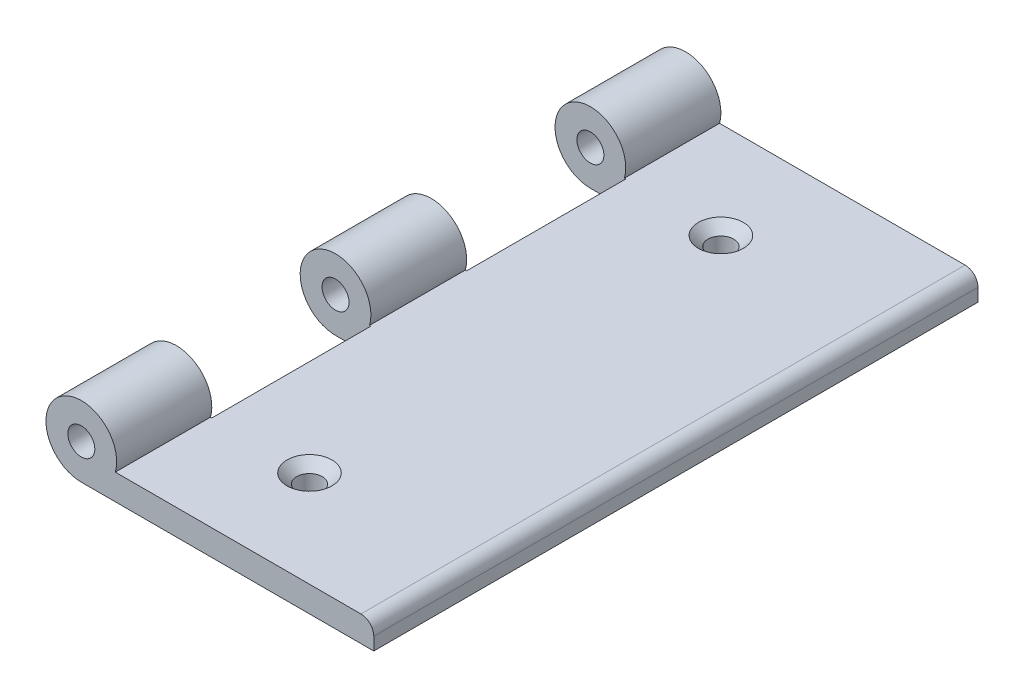
ISO-10303-21;
HEADER;
FILE_DESCRIPTION(('STEP AP214'),'2;1');
FILE_NAME('part.step','',(''),(''),'','','');
FILE_SCHEMA(('AUTOMOTIVE_DESIGN { 1 0 10303 214 1 1 1 1 }'));
ENDSEC;
DATA;
#1=APPLICATION_CONTEXT('core data for automotive mechanical design processes');
#2=APPLICATION_PROTOCOL_DEFINITION('international standard','automotive_design',2000,#1);
#3=PRODUCT_CONTEXT('',#1,'mechanical');
#4=PRODUCT('Part','Part','',(#3));
#5=PRODUCT_RELATED_PRODUCT_CATEGORY('part','',(#4));
#6=PRODUCT_DEFINITION_FORMATION('','',#4);
#7=PRODUCT_DEFINITION_CONTEXT('part definition',#1,'design');
#8=PRODUCT_DEFINITION('design','',#6,#7);
#9=PRODUCT_DEFINITION_SHAPE('','',#8);
#10=(LENGTH_UNIT() NAMED_UNIT(*) SI_UNIT(.MILLI.,.METRE.));
#11=(NAMED_UNIT(*) PLANE_ANGLE_UNIT() SI_UNIT($,.RADIAN.));
#12=(NAMED_UNIT(*) SI_UNIT($,.STERADIAN.) SOLID_ANGLE_UNIT());
#13=UNCERTAINTY_MEASURE_WITH_UNIT(LENGTH_MEASURE(1.E-05),#10,'distance_accuracy_value','');
#14=(GEOMETRIC_REPRESENTATION_CONTEXT(3) GLOBAL_UNCERTAINTY_ASSIGNED_CONTEXT((#13)) GLOBAL_UNIT_ASSIGNED_CONTEXT((#10,
#11,#12)) REPRESENTATION_CONTEXT('',''));
#15=CARTESIAN_POINT('',(0.,0.,0.));
#16=DIRECTION('',(0.,0.,1.));
#17=DIRECTION('',(1.,0.,0.));
#18=AXIS2_PLACEMENT_3D('',#15,#16,#17);
#19=CARTESIAN_POINT('',(0.,4.,0.));
#20=DIRECTION('',(0.,1.,0.));
#21=DIRECTION('',(0.,0.,1.));
#22=AXIS2_PLACEMENT_3D('',#19,#20,#21);
#23=PLANE('',#22);
#24=CARTESIAN_POINT('',(-4.99999999999999,4.,32.));
#25=DIRECTION('',(0.,1.,0.));
#26=DIRECTION('',(0.,0.,1.));
#27=AXIS2_PLACEMENT_3D('',#24,#25,#26);
#28=CIRCLE('',#27,3.50000000000002);
#29=CARTESIAN_POINT('',(-4.99999999999999,4.,35.5));
#30=VERTEX_POINT('',#29);
#31=EDGE_CURVE('E255',#30,#30,#28,.F.);
#32=ORIENTED_EDGE('',*,*,#31,.T.);
#33=EDGE_LOOP('',(#32));
#34=FACE_BOUND('',#33,.T.);
#35=CARTESIAN_POINT('',(-4.99999999999999,4.,-32.));
#36=DIRECTION('',(0.,1.,0.));
#37=DIRECTION('',(0.,0.,1.));
#38=AXIS2_PLACEMENT_3D('',#35,#36,#37);
#39=CIRCLE('',#38,3.50000000000002);
#40=CARTESIAN_POINT('',(-4.99999999999999,4.,-28.5));
#41=VERTEX_POINT('',#40);
#42=EDGE_CURVE('E252',#41,#41,#39,.F.);
#43=ORIENTED_EDGE('',*,*,#42,.T.);
#44=EDGE_LOOP('',(#43));
#45=FACE_BOUND('',#44,.T.);
#46=DIRECTION('',(1.,0.,0.));
#47=VECTOR('',#46,1.);
#48=CARTESIAN_POINT('',(-20.,4.,47.));
#49=LINE('',#48,#47);
#50=CARTESIAN_POINT('',(-20.2084973778708,4.,47.));
#51=VERTEX_POINT('',#50);
#52=CARTESIAN_POINT('',(18.,4.,47.));
#53=VERTEX_POINT('',#52);
#54=EDGE_CURVE('E221',#51,#53,#49,.T.);
#55=ORIENTED_EDGE('',*,*,#54,.T.);
#56=DIRECTION('',(0.,0.,-1.));
#57=VECTOR('',#56,1.);
#58=CARTESIAN_POINT('',(18.,4.,-47.));
#59=LINE('',#58,#57);
#60=CARTESIAN_POINT('',(18.,4.,-47.));
#61=VERTEX_POINT('',#60);
#62=EDGE_CURVE('E261',#53,#61,#59,.T.);
#63=ORIENTED_EDGE('',*,*,#62,.T.);
#64=DIRECTION('',(-1.,0.,0.));
#65=VECTOR('',#64,1.);
#66=CARTESIAN_POINT('',(-20.,4.,-47.));
#67=LINE('',#66,#65);
#68=CARTESIAN_POINT('',(-20.2084973778708,4.,-47.));
#69=VERTEX_POINT('',#68);
#70=EDGE_CURVE('E219',#61,#69,#67,.T.);
#71=ORIENTED_EDGE('',*,*,#70,.T.);
#72=DIRECTION('',(0.,0.,-1.));
#73=VECTOR('',#72,1.);
#74=CARTESIAN_POINT('',(-20.2084973778708,4.,47.));
#75=LINE('',#74,#73);
#76=CARTESIAN_POINT('',(-20.2084973778708,4.,-32.1999999999999));
#77=VERTEX_POINT('',#76);
#78=EDGE_CURVE('E213',#77,#69,#75,.T.);
#79=ORIENTED_EDGE('',*,*,#78,.F.);
#80=DIRECTION('',(1.,0.,0.));
#81=VECTOR('',#80,1.);
#82=CARTESIAN_POINT('',(0.,4.,-32.2));
#83=LINE('',#82,#81);
#84=CARTESIAN_POINT('',(-20.,4.,-32.2));
#85=VERTEX_POINT('',#84);
#86=EDGE_CURVE('E185',#77,#85,#83,.T.);
#87=ORIENTED_EDGE('',*,*,#86,.T.);
#88=DIRECTION('',(0.,0.,1.));
#89=VECTOR('',#88,1.);
#90=CARTESIAN_POINT('',(-20.,4.,0.));
#91=LINE('',#90,#89);
#92=CARTESIAN_POINT('',(-20.,4.,-7.45));
#93=VERTEX_POINT('',#92);
#94=EDGE_CURVE('E195',#85,#93,#91,.T.);
#95=ORIENTED_EDGE('',*,*,#94,.T.);
#96=DIRECTION('',(-1.,0.,0.));
#97=VECTOR('',#96,1.);
#98=CARTESIAN_POINT('',(0.,4.,-7.45));
#99=LINE('',#98,#97);
#100=CARTESIAN_POINT('',(-20.2084973778708,4.,-7.45));
#101=VERTEX_POINT('',#100);
#102=EDGE_CURVE('E135',#93,#101,#99,.T.);
#103=ORIENTED_EDGE('',*,*,#102,.T.);
#104=CARTESIAN_POINT('',(-20.2084973778708,4.,7.45000000000001));
#105=VERTEX_POINT('',#104);
#106=EDGE_CURVE('E218',#105,#101,#75,.T.);
#107=ORIENTED_EDGE('',*,*,#106,.F.);
#108=DIRECTION('',(1.,0.,0.));
#109=VECTOR('',#108,1.);
#110=CARTESIAN_POINT('',(0.,4.,7.45));
#111=LINE('',#110,#109);
#112=CARTESIAN_POINT('',(-20.,4.,7.45));
#113=VERTEX_POINT('',#112);
#114=EDGE_CURVE('E173',#105,#113,#111,.T.);
#115=ORIENTED_EDGE('',*,*,#114,.T.);
#116=DIRECTION('',(0.,0.,1.));
#117=VECTOR('',#116,1.);
#118=CARTESIAN_POINT('',(-20.,4.,0.));
#119=LINE('',#118,#117);
#120=CARTESIAN_POINT('',(-20.,4.,32.2));
#121=VERTEX_POINT('',#120);
#122=EDGE_CURVE('E192',#113,#121,#119,.T.);
#123=ORIENTED_EDGE('',*,*,#122,.T.);
#124=DIRECTION('',(-1.,0.,0.));
#125=VECTOR('',#124,1.);
#126=CARTESIAN_POINT('',(0.,4.,32.2));
#127=LINE('',#126,#125);
#128=CARTESIAN_POINT('',(-20.2084973778708,4.,32.2));
#129=VERTEX_POINT('',#128);
#130=EDGE_CURVE('E179',#121,#129,#127,.T.);
#131=ORIENTED_EDGE('',*,*,#130,.T.);
#132=EDGE_CURVE('E214',#51,#129,#75,.T.);
#133=ORIENTED_EDGE('',*,*,#132,.F.);
#134=EDGE_LOOP('',(#55,#63,#71,#79,#87,#95,#103,#107,#115,#123,#131,#133));
#135=FACE_BOUND('',#134,.T.);
#136=ADVANCED_FACE('F35',(#34,#45,#135),#23,.T.);
#137=CARTESIAN_POINT('',(0.,0.,0.));
#138=DIRECTION('',(0.,1.,0.));
#139=DIRECTION('',(0.,0.,1.));
#140=AXIS2_PLACEMENT_3D('',#137,#138,#139);
#141=PLANE('',#140);
#142=CARTESIAN_POINT('',(-4.99999999999999,0.,-32.));
#143=DIRECTION('',(0.,1.,0.));
#144=DIRECTION('',(0.,0.,1.));
#145=AXIS2_PLACEMENT_3D('',#142,#143,#144);
#146=CIRCLE('',#145,2.);
#147=CARTESIAN_POINT('',(-4.99999999999999,0.,-30.));
#148=VERTEX_POINT('',#147);
#149=EDGE_CURVE('E165',#148,#148,#146,.T.);
#150=ORIENTED_EDGE('',*,*,#149,.T.);
#151=EDGE_LOOP('',(#150));
#152=FACE_BOUND('',#151,.T.);
#153=CARTESIAN_POINT('',(-4.99999999999999,0.,32.));
#154=DIRECTION('',(0.,1.,0.));
#155=DIRECTION('',(0.,0.,1.));
#156=AXIS2_PLACEMENT_3D('',#153,#154,#155);
#157=CIRCLE('',#156,2.);
#158=CARTESIAN_POINT('',(-4.99999999999999,0.,34.));
#159=VERTEX_POINT('',#158);
#160=EDGE_CURVE('E245',#159,#159,#157,.T.);
#161=ORIENTED_EDGE('',*,*,#160,.T.);
#162=EDGE_LOOP('',(#161));
#163=FACE_BOUND('',#162,.T.);
#164=DIRECTION('',(1.,0.,0.));
#165=VECTOR('',#164,1.);
#166=CARTESIAN_POINT('',(-31.,0.,-7.45));
#167=LINE('',#166,#165);
#168=CARTESIAN_POINT('',(-25.5,0.,-7.45));
#169=VERTEX_POINT('',#168);
#170=CARTESIAN_POINT('',(-20.,0.,-7.45));
#171=VERTEX_POINT('',#170);
#172=EDGE_CURVE('E132',#169,#171,#167,.T.);
#173=ORIENTED_EDGE('',*,*,#172,.T.);
#174=DIRECTION('',(0.,0.,-1.));
#175=VECTOR('',#174,1.);
#176=CARTESIAN_POINT('',(-20.,0.,-32.2));
#177=LINE('',#176,#175);
#178=CARTESIAN_POINT('',(-20.,0.,-32.2));
#179=VERTEX_POINT('',#178);
#180=EDGE_CURVE('E142',#171,#179,#177,.T.);
#181=ORIENTED_EDGE('',*,*,#180,.T.);
#182=DIRECTION('',(-1.,0.,0.));
#183=VECTOR('',#182,1.);
#184=CARTESIAN_POINT('',(-31.,0.,-32.2));
#185=LINE('',#184,#183);
#186=CARTESIAN_POINT('',(-25.5,0.,-32.2));
#187=VERTEX_POINT('',#186);
#188=EDGE_CURVE('E148',#179,#187,#185,.T.);
#189=ORIENTED_EDGE('',*,*,#188,.T.);
#190=DIRECTION('',(0.,0.,-1.));
#191=VECTOR('',#190,1.);
#192=CARTESIAN_POINT('',(-25.5,0.,47.));
#193=LINE('',#192,#191);
#194=CARTESIAN_POINT('',(-25.5,0.,-47.));
#195=VERTEX_POINT('',#194);
#196=EDGE_CURVE('E209',#187,#195,#193,.T.);
#197=ORIENTED_EDGE('',*,*,#196,.T.);
#198=DIRECTION('',(-1.,0.,0.));
#199=VECTOR('',#198,1.);
#200=CARTESIAN_POINT('',(-20.,0.,-47.));
#201=LINE('',#200,#199);
#202=CARTESIAN_POINT('',(20.,0.,-47.));
#203=VERTEX_POINT('',#202);
#204=EDGE_CURVE('E228',#203,#195,#201,.T.);
#205=ORIENTED_EDGE('',*,*,#204,.F.);
#206=DIRECTION('',(0.,0.,-1.));
#207=VECTOR('',#206,1.);
#208=CARTESIAN_POINT('',(20.,0.,-47.));
#209=LINE('',#208,#207);
#210=CARTESIAN_POINT('',(20.,0.,47.));
#211=VERTEX_POINT('',#210);
#212=EDGE_CURVE('E217',#211,#203,#209,.T.);
#213=ORIENTED_EDGE('',*,*,#212,.F.);
#214=DIRECTION('',(1.,0.,0.));
#215=VECTOR('',#214,1.);
#216=CARTESIAN_POINT('',(-20.,0.,47.));
#217=LINE('',#216,#215);
#218=CARTESIAN_POINT('',(-25.5,0.,47.));
#219=VERTEX_POINT('',#218);
#220=EDGE_CURVE('E222',#219,#211,#217,.T.);
#221=ORIENTED_EDGE('',*,*,#220,.F.);
#222=CARTESIAN_POINT('',(-25.5,0.,32.2));
#223=VERTEX_POINT('',#222);
#224=EDGE_CURVE('E210',#219,#223,#193,.T.);
#225=ORIENTED_EDGE('',*,*,#224,.T.);
#226=DIRECTION('',(1.,0.,0.));
#227=VECTOR('',#226,1.);
#228=CARTESIAN_POINT('',(-31.,0.,32.2));
#229=LINE('',#228,#227);
#230=CARTESIAN_POINT('',(-20.,0.,32.2));
#231=VERTEX_POINT('',#230);
#232=EDGE_CURVE('E161',#223,#231,#229,.T.);
#233=ORIENTED_EDGE('',*,*,#232,.T.);
#234=DIRECTION('',(0.,0.,-1.));
#235=VECTOR('',#234,1.);
#236=CARTESIAN_POINT('',(-20.,0.,7.45));
#237=LINE('',#236,#235);
#238=CARTESIAN_POINT('',(-20.,0.,7.45));
#239=VERTEX_POINT('',#238);
#240=EDGE_CURVE('E164',#231,#239,#237,.T.);
#241=ORIENTED_EDGE('',*,*,#240,.T.);
#242=DIRECTION('',(-1.,0.,0.));
#243=VECTOR('',#242,1.);
#244=CARTESIAN_POINT('',(-31.,0.,7.45));
#245=LINE('',#244,#243);
#246=CARTESIAN_POINT('',(-25.5,0.,7.45));
#247=VERTEX_POINT('',#246);
#248=EDGE_CURVE('E168',#239,#247,#245,.T.);
#249=ORIENTED_EDGE('',*,*,#248,.T.);
#250=EDGE_CURVE('E153',#247,#169,#193,.T.);
#251=ORIENTED_EDGE('',*,*,#250,.T.);
#252=EDGE_LOOP('',(#173,#181,#189,#197,#205,#213,#221,#225,#233,#241,#249,#251));
#253=FACE_BOUND('',#252,.T.);
#254=ADVANCED_FACE('F150',(#152,#163,#253),#141,.F.);
#255=CARTESIAN_POINT('',(-25.5,5.5,47.));
#256=DIRECTION('',(0.,0.,-1.));
#257=DIRECTION('',(-1.,0.,0.));
#258=AXIS2_PLACEMENT_3D('',#255,#256,#257);
#259=CYLINDRICAL_SURFACE('',#258,5.5);
#260=CARTESIAN_POINT('',(-25.5,5.5,-7.45));
#261=DIRECTION('',(0.,0.,-1.));
#262=DIRECTION('',(-1.,0.,0.));
#263=AXIS2_PLACEMENT_3D('',#260,#261,#262);
#264=CIRCLE('',#263,5.5);
#265=EDGE_CURVE('E189',#169,#101,#264,.T.);
#266=ORIENTED_EDGE('',*,*,#265,.F.);
#267=ORIENTED_EDGE('',*,*,#250,.F.);
#268=CARTESIAN_POINT('',(-25.5,5.5,7.45));
#269=DIRECTION('',(0.,0.,1.));
#270=DIRECTION('',(1.,0.,0.));
#271=AXIS2_PLACEMENT_3D('',#268,#269,#270);
#272=CIRCLE('',#271,5.5);
#273=EDGE_CURVE('E171',#105,#247,#272,.T.);
#274=ORIENTED_EDGE('',*,*,#273,.F.);
#275=ORIENTED_EDGE('',*,*,#106,.T.);
#276=EDGE_LOOP('',(#266,#267,#274,#275));
#277=FACE_BOUND('',#276,.T.);
#278=ADVANCED_FACE('F283',(#277),#259,.T.);
#279=ORIENTED_EDGE('',*,*,#196,.F.);
#280=CARTESIAN_POINT('',(-25.5,5.5,-32.2));
#281=DIRECTION('',(0.,0.,1.));
#282=DIRECTION('',(1.,0.,0.));
#283=AXIS2_PLACEMENT_3D('',#280,#281,#282);
#284=CIRCLE('',#283,5.5);
#285=EDGE_CURVE('E183',#77,#187,#284,.T.);
#286=ORIENTED_EDGE('',*,*,#285,.F.);
#287=ORIENTED_EDGE('',*,*,#78,.T.);
#288=CARTESIAN_POINT('',(-25.5,5.5,-47.));
#289=DIRECTION('',(0.,0.,1.));
#290=DIRECTION('',(1.,0.,0.));
#291=AXIS2_PLACEMENT_3D('',#288,#289,#290);
#292=CIRCLE('',#291,5.5);
#293=EDGE_CURVE('E200',#69,#195,#292,.T.);
#294=ORIENTED_EDGE('',*,*,#293,.T.);
#295=EDGE_LOOP('',(#279,#286,#287,#294));
#296=FACE_BOUND('',#295,.T.);
#297=ADVANCED_FACE('F277',(#296),#259,.T.);
#298=CARTESIAN_POINT('',(-25.5,5.5,32.2));
#299=DIRECTION('',(0.,0.,-1.));
#300=DIRECTION('',(-1.,0.,0.));
#301=AXIS2_PLACEMENT_3D('',#298,#299,#300);
#302=CIRCLE('',#301,5.5);
#303=EDGE_CURVE('E177',#223,#129,#302,.T.);
#304=ORIENTED_EDGE('',*,*,#303,.F.);
#305=ORIENTED_EDGE('',*,*,#224,.F.);
#306=CARTESIAN_POINT('',(-25.5,5.5,47.));
#307=DIRECTION('',(0.,0.,1.));
#308=DIRECTION('',(1.,0.,0.));
#309=AXIS2_PLACEMENT_3D('',#306,#307,#308);
#310=CIRCLE('',#309,5.5);
#311=EDGE_CURVE('E206',#51,#219,#310,.T.);
#312=ORIENTED_EDGE('',*,*,#311,.F.);
#313=ORIENTED_EDGE('',*,*,#132,.T.);
#314=EDGE_LOOP('',(#304,#305,#312,#313));
#315=FACE_BOUND('',#314,.T.);
#316=ADVANCED_FACE('F295',(#315),#259,.T.);
#317=CARTESIAN_POINT('',(-25.5,5.5,47.));
#318=DIRECTION('',(0.,0.,-1.));
#319=DIRECTION('',(-1.,0.,0.));
#320=AXIS2_PLACEMENT_3D('',#317,#318,#319);
#321=CYLINDRICAL_SURFACE('',#320,2.1);
#322=CARTESIAN_POINT('',(-25.5,5.5,-47.));
#323=DIRECTION('',(0.,0.,1.));
#324=DIRECTION('',(1.,0.,0.));
#325=AXIS2_PLACEMENT_3D('',#322,#323,#324);
#326=CIRCLE('',#325,2.1);
#327=CARTESIAN_POINT('',(-27.6,5.5,-47.));
#328=VERTEX_POINT('',#327);
#329=EDGE_CURVE('E197',#328,#328,#326,.T.);
#330=CARTESIAN_POINT('',(-25.5,5.5,-32.2));
#331=DIRECTION('',(0.,0.,1.));
#332=DIRECTION('',(1.,0.,0.));
#333=AXIS2_PLACEMENT_3D('',#330,#331,#332);
#334=CIRCLE('',#333,2.1);
#335=CARTESIAN_POINT('',(-27.6,5.5,-32.2));
#336=VERTEX_POINT('',#335);
#337=EDGE_CURVE('E182',#336,#336,#334,.T.);
#338=CARTESIAN_POINT('',(-27.6,5.5,-47.));
#339=CARTESIAN_POINT('',(-27.6,5.5,-46.8458333333333));
#340=CARTESIAN_POINT('',(-27.6,5.5,-46.6916666666667));
#341=CARTESIAN_POINT('',(-27.6,5.5,-46.3833333333333));
#342=CARTESIAN_POINT('',(-27.6,5.5,-46.2291666666667));
#343=CARTESIAN_POINT('',(-27.6,5.5,-45.9208333333333));
#344=CARTESIAN_POINT('',(-27.6,5.5,-45.7666666666667));
#345=CARTESIAN_POINT('',(-27.6,5.5,-45.4583333333333));
#346=CARTESIAN_POINT('',(-27.6,5.5,-45.3041666666667));
#347=CARTESIAN_POINT('',(-27.6,5.5,-44.9958333333333));
#348=CARTESIAN_POINT('',(-27.6,5.5,-44.8416666666667));
#349=CARTESIAN_POINT('',(-27.6,5.5,-44.5333333333333));
#350=CARTESIAN_POINT('',(-27.6,5.5,-44.3791666666667));
#351=CARTESIAN_POINT('',(-27.6,5.5,-44.0708333333333));
#352=CARTESIAN_POINT('',(-27.6,5.5,-43.9166666666667));
#353=CARTESIAN_POINT('',(-27.6,5.5,-43.6083333333333));
#354=CARTESIAN_POINT('',(-27.6,5.5,-43.4541666666667));
#355=CARTESIAN_POINT('',(-27.6,5.5,-43.1458333333333));
#356=CARTESIAN_POINT('',(-27.6,5.5,-42.9916666666667));
#357=CARTESIAN_POINT('',(-27.6,5.5,-42.6833333333333));
#358=CARTESIAN_POINT('',(-27.6,5.5,-42.5291666666667));
#359=CARTESIAN_POINT('',(-27.6,5.5,-42.2208333333333));
#360=CARTESIAN_POINT('',(-27.6,5.5,-42.0666666666667));
#361=CARTESIAN_POINT('',(-27.6,5.5,-41.7583333333333));
#362=CARTESIAN_POINT('',(-27.6,5.5,-41.6041666666667));
#363=CARTESIAN_POINT('',(-27.6,5.5,-41.2958333333333));
#364=CARTESIAN_POINT('',(-27.6,5.5,-41.1416666666667));
#365=CARTESIAN_POINT('',(-27.6,5.5,-40.8333333333333));
#366=CARTESIAN_POINT('',(-27.6,5.5,-40.6791666666667));
#367=CARTESIAN_POINT('',(-27.6,5.5,-40.3708333333333));
#368=CARTESIAN_POINT('',(-27.6,5.5,-40.2166666666667));
#369=CARTESIAN_POINT('',(-27.6,5.5,-39.9083333333333));
#370=CARTESIAN_POINT('',(-27.6,5.5,-39.7541666666667));
#371=CARTESIAN_POINT('',(-27.6,5.5,-39.4458333333333));
#372=CARTESIAN_POINT('',(-27.6,5.5,-39.2916666666667));
#373=CARTESIAN_POINT('',(-27.6,5.5,-38.9833333333333));
#374=CARTESIAN_POINT('',(-27.6,5.5,-38.8291666666667));
#375=CARTESIAN_POINT('',(-27.6,5.5,-38.5208333333333));
#376=CARTESIAN_POINT('',(-27.6,5.5,-38.3666666666667));
#377=CARTESIAN_POINT('',(-27.6,5.5,-38.0583333333333));
#378=CARTESIAN_POINT('',(-27.6,5.5,-37.9041666666667));
#379=CARTESIAN_POINT('',(-27.6,5.5,-37.5958333333333));
#380=CARTESIAN_POINT('',(-27.6,5.5,-37.4416666666666));
#381=CARTESIAN_POINT('',(-27.6,5.5,-37.1333333333333));
#382=CARTESIAN_POINT('',(-27.6,5.5,-36.9791666666667));
#383=CARTESIAN_POINT('',(-27.6,5.5,-36.6708333333333));
#384=CARTESIAN_POINT('',(-27.6,5.5,-36.5166666666667));
#385=CARTESIAN_POINT('',(-27.6,5.5,-36.2083333333333));
#386=CARTESIAN_POINT('',(-27.6,5.5,-36.0541666666667));
#387=CARTESIAN_POINT('',(-27.6,5.5,-35.7458333333333));
#388=CARTESIAN_POINT('',(-27.6,5.5,-35.5916666666667));
#389=CARTESIAN_POINT('',(-27.6,5.5,-35.2833333333333));
#390=CARTESIAN_POINT('',(-27.6,5.5,-35.1291666666667));
#391=CARTESIAN_POINT('',(-27.6,5.5,-34.8208333333333));
#392=CARTESIAN_POINT('',(-27.6,5.5,-34.6666666666667));
#393=CARTESIAN_POINT('',(-27.6,5.5,-34.3583333333333));
#394=CARTESIAN_POINT('',(-27.6,5.5,-34.2041666666667));
#395=CARTESIAN_POINT('',(-27.6,5.5,-33.8958333333333));
#396=CARTESIAN_POINT('',(-27.6,5.5,-33.7416666666667));
#397=CARTESIAN_POINT('',(-27.6,5.5,-33.4333333333333));
#398=CARTESIAN_POINT('',(-27.6,5.5,-33.2791666666667));
#399=CARTESIAN_POINT('',(-27.6,5.5,-32.9708333333333));
#400=CARTESIAN_POINT('',(-27.6,5.5,-32.8166666666667));
#401=CARTESIAN_POINT('',(-27.6,5.5,-32.5083333333333));
#402=CARTESIAN_POINT('',(-27.6,5.5,-32.3541666666667));
#403=CARTESIAN_POINT('',(-27.6,5.5,-32.2));
#404=B_SPLINE_CURVE_WITH_KNOTS('',3,(#338,#339,#340,#341,#342,#343,#344,#345,#346,#347,#348,
#349,#350,#351,#352,#353,#354,#355,#356,#357,#358,#359,#360,#361,#362,#363,#364,#365,#366,#367,
#368,#369,#370,#371,#372,#373,#374,#375,#376,#377,#378,#379,#380,#381,#382,#383,#384,#385,#386,
#387,#388,#389,#390,#391,#392,#393,#394,#395,#396,#397,#398,#399,#400,#401,#402,#403),
.UNSPECIFIED.,.F.,.F.,(4,2,2,2,2,2,2,2,2,2,2,2,2,2,2,2,2,2,2,2,2,2,2,2,2,2,2,2,2,2,2,2,4),(0.,
0.462500000000005,0.924999999999995,1.3875,1.85,2.3125,2.775,3.2375,3.70000000000001,4.1625,
4.625,5.08750000000001,5.55,6.0125,6.47500000000001,6.9375,7.4,7.86250000000001,8.325,8.7875,
9.25000000000001,9.71250000000001,10.175,10.6375,11.1,11.5625,12.025,12.4875,12.95,13.4125,
13.875,14.3375,14.8),.UNSPECIFIED.);
#405=EDGE_CURVE('BSEAM374',#328,#336,#404,.T.);
#406=ORIENTED_EDGE('',*,*,#329,.F.);
#407=ORIENTED_EDGE('',*,*,#337,.T.);
#408=ORIENTED_EDGE('',*,*,#405,.T.);
#409=ORIENTED_EDGE('',*,*,#405,.F.);
#410=EDGE_LOOP('',(#406,#408,#407,#409));
#411=FACE_BOUND('',#410,.T.);
#412=ADVANCED_FACE('F374',(#411),#321,.F.);
#413=CARTESIAN_POINT('',(-25.5,5.5,47.));
#414=DIRECTION('',(0.,0.,1.));
#415=DIRECTION('',(1.,0.,0.));
#416=AXIS2_PLACEMENT_3D('',#413,#414,#415);
#417=CIRCLE('',#416,2.1);
#418=CARTESIAN_POINT('',(-27.6,5.5,47.));
#419=VERTEX_POINT('',#418);
#420=EDGE_CURVE('E203',#419,#419,#417,.T.);
#421=CARTESIAN_POINT('',(-25.5,5.5,32.2));
#422=DIRECTION('',(0.,0.,-1.));
#423=DIRECTION('',(-1.,0.,0.));
#424=AXIS2_PLACEMENT_3D('',#421,#422,#423);
#425=CIRCLE('',#424,2.1);
#426=CARTESIAN_POINT('',(-27.6,5.5,32.2));
#427=VERTEX_POINT('',#426);
#428=EDGE_CURVE('E176',#427,#427,#425,.T.);
#429=CARTESIAN_POINT('',(-27.6,5.5,47.));
#430=CARTESIAN_POINT('',(-27.6,5.5,46.8458333333334));
#431=CARTESIAN_POINT('',(-27.6,5.5,46.6916666666667));
#432=CARTESIAN_POINT('',(-27.6,5.5,46.3833333333334));
#433=CARTESIAN_POINT('',(-27.6,5.5,46.2291666666667));
#434=CARTESIAN_POINT('',(-27.6,5.5,45.9208333333334));
#435=CARTESIAN_POINT('',(-27.6,5.5,45.7666666666667));
#436=CARTESIAN_POINT('',(-27.6,5.5,45.4583333333333));
#437=CARTESIAN_POINT('',(-27.6,5.5,45.3041666666667));
#438=CARTESIAN_POINT('',(-27.6,5.5,44.9958333333334));
#439=CARTESIAN_POINT('',(-27.6,5.5,44.8416666666667));
#440=CARTESIAN_POINT('',(-27.6,5.5,44.5333333333334));
#441=CARTESIAN_POINT('',(-27.6,5.5,44.3791666666667));
#442=CARTESIAN_POINT('',(-27.6,5.5,44.0708333333334));
#443=CARTESIAN_POINT('',(-27.6,5.5,43.9166666666667));
#444=CARTESIAN_POINT('',(-27.6,5.5,43.6083333333334));
#445=CARTESIAN_POINT('',(-27.6,5.5,43.4541666666667));
#446=CARTESIAN_POINT('',(-27.6,5.5,43.1458333333334));
#447=CARTESIAN_POINT('',(-27.6,5.5,42.9916666666667));
#448=CARTESIAN_POINT('',(-27.6,5.5,42.6833333333334));
#449=CARTESIAN_POINT('',(-27.6,5.5,42.5291666666667));
#450=CARTESIAN_POINT('',(-27.6,5.5,42.2208333333334));
#451=CARTESIAN_POINT('',(-27.6,5.5,42.0666666666667));
#452=CARTESIAN_POINT('',(-27.6,5.5,41.7583333333334));
#453=CARTESIAN_POINT('',(-27.6,5.5,41.6041666666667));
#454=CARTESIAN_POINT('',(-27.6,5.5,41.2958333333334));
#455=CARTESIAN_POINT('',(-27.6,5.5,41.1416666666667));
#456=CARTESIAN_POINT('',(-27.6,5.5,40.8333333333333));
#457=CARTESIAN_POINT('',(-27.6,5.5,40.6791666666667));
#458=CARTESIAN_POINT('',(-27.6,5.5,40.3708333333334));
#459=CARTESIAN_POINT('',(-27.6,5.5,40.2166666666667));
#460=CARTESIAN_POINT('',(-27.6,5.5,39.9083333333334));
#461=CARTESIAN_POINT('',(-27.6,5.5,39.7541666666667));
#462=CARTESIAN_POINT('',(-27.6,5.5,39.4458333333334));
#463=CARTESIAN_POINT('',(-27.6,5.5,39.2916666666667));
#464=CARTESIAN_POINT('',(-27.6,5.5,38.9833333333334));
#465=CARTESIAN_POINT('',(-27.6,5.5,38.8291666666667));
#466=CARTESIAN_POINT('',(-27.6,5.5,38.5208333333334));
#467=CARTESIAN_POINT('',(-27.6,5.5,38.3666666666667));
#468=CARTESIAN_POINT('',(-27.6,5.5,38.0583333333334));
#469=CARTESIAN_POINT('',(-27.6,5.5,37.9041666666667));
#470=CARTESIAN_POINT('',(-27.6,5.5,37.5958333333334));
#471=CARTESIAN_POINT('',(-27.6,5.5,37.4416666666667));
#472=CARTESIAN_POINT('',(-27.6,5.5,37.1333333333334));
#473=CARTESIAN_POINT('',(-27.6,5.5,36.9791666666667));
#474=CARTESIAN_POINT('',(-27.6,5.5,36.6708333333334));
#475=CARTESIAN_POINT('',(-27.6,5.5,36.5166666666667));
#476=CARTESIAN_POINT('',(-27.6,5.5,36.2083333333334));
#477=CARTESIAN_POINT('',(-27.6,5.5,36.0541666666667));
#478=CARTESIAN_POINT('',(-27.6,5.5,35.7458333333334));
#479=CARTESIAN_POINT('',(-27.6,5.5,35.5916666666667));
#480=CARTESIAN_POINT('',(-27.6,5.5,35.2833333333334));
#481=CARTESIAN_POINT('',(-27.6,5.5,35.1291666666667));
#482=CARTESIAN_POINT('',(-27.6,5.5,34.8208333333334));
#483=CARTESIAN_POINT('',(-27.6,5.5,34.6666666666667));
#484=CARTESIAN_POINT('',(-27.6,5.5,34.3583333333334));
#485=CARTESIAN_POINT('',(-27.6,5.5,34.2041666666667));
#486=CARTESIAN_POINT('',(-27.6,5.5,33.8958333333334));
#487=CARTESIAN_POINT('',(-27.6,5.5,33.7416666666667));
#488=CARTESIAN_POINT('',(-27.6,5.5,33.4333333333334));
#489=CARTESIAN_POINT('',(-27.6,5.5,33.2791666666667));
#490=CARTESIAN_POINT('',(-27.6,5.5,32.9708333333334));
#491=CARTESIAN_POINT('',(-27.6,5.5,32.8166666666667));
#492=CARTESIAN_POINT('',(-27.6,5.5,32.5083333333334));
#493=CARTESIAN_POINT('',(-27.6,5.5,32.3541666666667));
#494=CARTESIAN_POINT('',(-27.6,5.5,32.2));
#495=B_SPLINE_CURVE_WITH_KNOTS('',3,(#429,#430,#431,#432,#433,#434,#435,#436,#437,#438,#439,
#440,#441,#442,#443,#444,#445,#446,#447,#448,#449,#450,#451,#452,#453,#454,#455,#456,#457,#458,
#459,#460,#461,#462,#463,#464,#465,#466,#467,#468,#469,#470,#471,#472,#473,#474,#475,#476,#477,
#478,#479,#480,#481,#482,#483,#484,#485,#486,#487,#488,#489,#490,#491,#492,#493,#494),
.UNSPECIFIED.,.F.,.F.,(4,2,2,2,2,2,2,2,2,2,2,2,2,2,2,2,2,2,2,2,2,2,2,2,2,2,2,2,2,2,2,2,4),(0.,
0.462500000000005,0.925000000000002,1.3875,1.85,2.3125,2.775,3.2375,3.7,4.1625,4.625,5.0875,
5.55,6.0125,6.475,6.9375,7.4,7.8625,8.325,8.7875,9.25,9.7125,10.175,10.6375,11.1,11.5625,12.025,
12.4875,12.95,13.4125,13.875,14.3375,14.8),.UNSPECIFIED.);
#496=EDGE_CURVE('BSEAM337',#419,#427,#495,.T.);
#497=ORIENTED_EDGE('',*,*,#420,.T.);
#498=ORIENTED_EDGE('',*,*,#428,.T.);
#499=ORIENTED_EDGE('',*,*,#496,.T.);
#500=ORIENTED_EDGE('',*,*,#496,.F.);
#501=EDGE_LOOP('',(#497,#499,#498,#500));
#502=FACE_BOUND('',#501,.T.);
#503=ADVANCED_FACE('F337',(#502),#321,.F.);
#504=CARTESIAN_POINT('',(20.,4.,-47.));
#505=DIRECTION('',(-1.,0.,0.));
#506=DIRECTION('',(0.,0.,1.));
#507=AXIS2_PLACEMENT_3D('',#504,#505,#506);
#508=PLANE('',#507);
#509=DIRECTION('',(0.,-1.,0.));
#510=VECTOR('',#509,1.);
#511=CARTESIAN_POINT('',(20.,4.,-47.));
#512=LINE('',#511,#510);
#513=CARTESIAN_POINT('',(20.,2.,-47.));
#514=VERTEX_POINT('',#513);
#515=EDGE_CURVE('E234',#514,#203,#512,.T.);
#516=ORIENTED_EDGE('',*,*,#515,.F.);
#517=DIRECTION('',(0.,0.,-1.));
#518=VECTOR('',#517,1.);
#519=CARTESIAN_POINT('',(20.,2.,47.));
#520=LINE('',#519,#518);
#521=CARTESIAN_POINT('',(20.,2.,47.));
#522=VERTEX_POINT('',#521);
#523=EDGE_CURVE('E43',#514,#522,#520,.F.);
#524=ORIENTED_EDGE('',*,*,#523,.T.);
#525=DIRECTION('',(0.,-1.,0.));
#526=VECTOR('',#525,1.);
#527=CARTESIAN_POINT('',(20.,4.,47.));
#528=LINE('',#527,#526);
#529=EDGE_CURVE('E225',#522,#211,#528,.T.);
#530=ORIENTED_EDGE('',*,*,#529,.T.);
#531=ORIENTED_EDGE('',*,*,#212,.T.);
#532=EDGE_LOOP('',(#516,#524,#530,#531));
#533=FACE_BOUND('',#532,.T.);
#534=ADVANCED_FACE('F287',(#533),#508,.F.);
#535=CARTESIAN_POINT('',(-20.,4.,-47.));
#536=DIRECTION('',(0.,0.,1.));
#537=DIRECTION('',(1.,0.,0.));
#538=AXIS2_PLACEMENT_3D('',#535,#536,#537);
#539=PLANE('',#538);
#540=ORIENTED_EDGE('',*,*,#70,.F.);
#541=CARTESIAN_POINT('',(18.,2.,-47.));
#542=DIRECTION('',(0.,0.,1.));
#543=DIRECTION('',(1.,0.,0.));
#544=AXIS2_PLACEMENT_3D('',#541,#542,#543);
#545=CIRCLE('',#544,2.);
#546=EDGE_CURVE('E57',#61,#514,#545,.F.);
#547=ORIENTED_EDGE('',*,*,#546,.T.);
#548=ORIENTED_EDGE('',*,*,#515,.T.);
#549=ORIENTED_EDGE('',*,*,#204,.T.);
#550=ORIENTED_EDGE('',*,*,#293,.F.);
#551=EDGE_LOOP('',(#540,#547,#548,#549,#550));
#552=FACE_BOUND('',#551,.T.);
#553=ORIENTED_EDGE('',*,*,#329,.T.);
#554=EDGE_LOOP('',(#553));
#555=FACE_BOUND('',#554,.T.);
#556=ADVANCED_FACE('F272',(#552,#555),#539,.F.);
#557=CARTESIAN_POINT('',(-20.,4.,47.));
#558=DIRECTION('',(0.,0.,-1.));
#559=DIRECTION('',(-1.,0.,0.));
#560=AXIS2_PLACEMENT_3D('',#557,#558,#559);
#561=PLANE('',#560);
#562=ORIENTED_EDGE('',*,*,#529,.F.);
#563=CARTESIAN_POINT('',(18.,2.,47.));
#564=DIRECTION('',(0.,0.,-1.));
#565=DIRECTION('',(-1.,0.,0.));
#566=AXIS2_PLACEMENT_3D('',#563,#564,#565);
#567=CIRCLE('',#566,2.);
#568=EDGE_CURVE('E11',#522,#53,#567,.F.);
#569=ORIENTED_EDGE('',*,*,#568,.T.);
#570=ORIENTED_EDGE('',*,*,#54,.F.);
#571=ORIENTED_EDGE('',*,*,#311,.T.);
#572=ORIENTED_EDGE('',*,*,#220,.T.);
#573=EDGE_LOOP('',(#562,#569,#570,#571,#572));
#574=FACE_BOUND('',#573,.T.);
#575=ORIENTED_EDGE('',*,*,#420,.F.);
#576=EDGE_LOOP('',(#575));
#577=FACE_BOUND('',#576,.T.);
#578=ADVANCED_FACE('F289',(#574,#577),#561,.F.);
#579=CARTESIAN_POINT('',(-20.,14.,7.45));
#580=DIRECTION('',(-1.,0.,0.));
#581=DIRECTION('',(0.,0.,1.));
#582=AXIS2_PLACEMENT_3D('',#579,#580,#581);
#583=PLANE('',#582);
#584=DIRECTION('',(0.,-1.,0.));
#585=VECTOR('',#584,1.);
#586=CARTESIAN_POINT('',(-20.,14.,7.45));
#587=LINE('',#586,#585);
#588=EDGE_CURVE('E156',#113,#239,#587,.T.);
#589=ORIENTED_EDGE('',*,*,#588,.T.);
#590=ORIENTED_EDGE('',*,*,#240,.F.);
#591=DIRECTION('',(0.,-1.,0.));
#592=VECTOR('',#591,1.);
#593=CARTESIAN_POINT('',(-20.,14.,32.2));
#594=LINE('',#593,#592);
#595=EDGE_CURVE('E154',#121,#231,#594,.T.);
#596=ORIENTED_EDGE('',*,*,#595,.F.);
#597=ORIENTED_EDGE('',*,*,#122,.F.);
#598=EDGE_LOOP('',(#589,#590,#596,#597));
#599=FACE_BOUND('',#598,.T.);
#600=ADVANCED_FACE('F301',(#599),#583,.T.);
#601=CARTESIAN_POINT('',(-31.,14.,32.2));
#602=DIRECTION('',(0.,0.,-1.));
#603=DIRECTION('',(-1.,0.,0.));
#604=AXIS2_PLACEMENT_3D('',#601,#602,#603);
#605=PLANE('',#604);
#606=ORIENTED_EDGE('',*,*,#428,.F.);
#607=EDGE_LOOP('',(#606));
#608=FACE_BOUND('',#607,.T.);
#609=ORIENTED_EDGE('',*,*,#595,.T.);
#610=ORIENTED_EDGE('',*,*,#232,.F.);
#611=ORIENTED_EDGE('',*,*,#303,.T.);
#612=ORIENTED_EDGE('',*,*,#130,.F.);
#613=EDGE_LOOP('',(#609,#610,#611,#612));
#614=FACE_BOUND('',#613,.T.);
#615=ADVANCED_FACE('F297',(#608,#614),#605,.T.);
#616=CARTESIAN_POINT('',(-31.,14.,7.45));
#617=DIRECTION('',(0.,0.,1.));
#618=DIRECTION('',(1.,0.,0.));
#619=AXIS2_PLACEMENT_3D('',#616,#617,#618);
#620=PLANE('',#619);
#621=CARTESIAN_POINT('',(-25.5,5.5,7.45));
#622=DIRECTION('',(0.,0.,1.));
#623=DIRECTION('',(1.,0.,0.));
#624=AXIS2_PLACEMENT_3D('',#621,#622,#623);
#625=CIRCLE('',#624,2.1);
#626=CARTESIAN_POINT('',(-27.6,5.5,7.45));
#627=VERTEX_POINT('',#626);
#628=EDGE_CURVE('E138',#627,#627,#625,.T.);
#629=ORIENTED_EDGE('',*,*,#628,.F.);
#630=EDGE_LOOP('',(#629));
#631=FACE_BOUND('',#630,.T.);
#632=ORIENTED_EDGE('',*,*,#273,.T.);
#633=ORIENTED_EDGE('',*,*,#248,.F.);
#634=ORIENTED_EDGE('',*,*,#588,.F.);
#635=ORIENTED_EDGE('',*,*,#114,.F.);
#636=EDGE_LOOP('',(#632,#633,#634,#635));
#637=FACE_BOUND('',#636,.T.);
#638=ADVANCED_FACE('F305',(#631,#637),#620,.T.);
#639=CARTESIAN_POINT('',(-20.,14.,-32.2));
#640=DIRECTION('',(-1.,0.,0.));
#641=DIRECTION('',(0.,0.,1.));
#642=AXIS2_PLACEMENT_3D('',#639,#640,#641);
#643=PLANE('',#642);
#644=DIRECTION('',(0.,-1.,0.));
#645=VECTOR('',#644,1.);
#646=CARTESIAN_POINT('',(-20.,14.,-32.2));
#647=LINE('',#646,#645);
#648=EDGE_CURVE('E139',#85,#179,#647,.T.);
#649=ORIENTED_EDGE('',*,*,#648,.T.);
#650=ORIENTED_EDGE('',*,*,#180,.F.);
#651=DIRECTION('',(0.,-1.,0.));
#652=VECTOR('',#651,1.);
#653=CARTESIAN_POINT('',(-20.,14.,-7.45));
#654=LINE('',#653,#652);
#655=EDGE_CURVE('E128',#93,#171,#654,.T.);
#656=ORIENTED_EDGE('',*,*,#655,.F.);
#657=ORIENTED_EDGE('',*,*,#94,.F.);
#658=EDGE_LOOP('',(#649,#650,#656,#657));
#659=FACE_BOUND('',#658,.T.);
#660=ADVANCED_FACE('F143',(#659),#643,.T.);
#661=CARTESIAN_POINT('',(-31.,14.,-7.45));
#662=DIRECTION('',(0.,0.,-1.));
#663=DIRECTION('',(-1.,0.,0.));
#664=AXIS2_PLACEMENT_3D('',#661,#662,#663);
#665=PLANE('',#664);
#666=CARTESIAN_POINT('',(-25.5,5.5,-7.45));
#667=DIRECTION('',(0.,0.,-1.));
#668=DIRECTION('',(-1.,0.,0.));
#669=AXIS2_PLACEMENT_3D('',#666,#667,#668);
#670=CIRCLE('',#669,2.1);
#671=CARTESIAN_POINT('',(-27.6,5.5,-7.45));
#672=VERTEX_POINT('',#671);
#673=EDGE_CURVE('E188',#672,#672,#670,.T.);
#674=ORIENTED_EDGE('',*,*,#673,.F.);
#675=EDGE_LOOP('',(#674));
#676=FACE_BOUND('',#675,.T.);
#677=ORIENTED_EDGE('',*,*,#655,.T.);
#678=ORIENTED_EDGE('',*,*,#172,.F.);
#679=ORIENTED_EDGE('',*,*,#265,.T.);
#680=ORIENTED_EDGE('',*,*,#102,.F.);
#681=EDGE_LOOP('',(#677,#678,#679,#680));
#682=FACE_BOUND('',#681,.T.);
#683=ADVANCED_FACE('F130',(#676,#682),#665,.T.);
#684=CARTESIAN_POINT('',(-31.,14.,-32.2));
#685=DIRECTION('',(0.,0.,1.));
#686=DIRECTION('',(1.,0.,0.));
#687=AXIS2_PLACEMENT_3D('',#684,#685,#686);
#688=PLANE('',#687);
#689=ORIENTED_EDGE('',*,*,#337,.F.);
#690=EDGE_LOOP('',(#689));
#691=FACE_BOUND('',#690,.T.);
#692=ORIENTED_EDGE('',*,*,#285,.T.);
#693=ORIENTED_EDGE('',*,*,#188,.F.);
#694=ORIENTED_EDGE('',*,*,#648,.F.);
#695=ORIENTED_EDGE('',*,*,#86,.F.);
#696=EDGE_LOOP('',(#692,#693,#694,#695));
#697=FACE_BOUND('',#696,.T.);
#698=ADVANCED_FACE('F285',(#691,#697),#688,.T.);
#699=CARTESIAN_POINT('',(-27.6,5.5,7.45));
#700=CARTESIAN_POINT('',(-27.6,5.5,7.29479166666667));
#701=CARTESIAN_POINT('',(-27.6,5.5,7.13958333333333));
#702=CARTESIAN_POINT('',(-27.6,5.5,6.82916666666667));
#703=CARTESIAN_POINT('',(-27.6,5.5,6.67395833333333));
#704=CARTESIAN_POINT('',(-27.6,5.5,6.36354166666666));
#705=CARTESIAN_POINT('',(-27.6,5.5,6.20833333333333));
#706=CARTESIAN_POINT('',(-27.6,5.5,5.89791666666667));
#707=CARTESIAN_POINT('',(-27.6,5.5,5.74270833333333));
#708=CARTESIAN_POINT('',(-27.6,5.5,5.43229166666666));
#709=CARTESIAN_POINT('',(-27.6,5.5,5.27708333333333));
#710=CARTESIAN_POINT('',(-27.6,5.5,4.96666666666667));
#711=CARTESIAN_POINT('',(-27.6,5.5,4.81145833333333));
#712=CARTESIAN_POINT('',(-27.6,5.5,4.50104166666667));
#713=CARTESIAN_POINT('',(-27.6,5.5,4.34583333333333));
#714=CARTESIAN_POINT('',(-27.6,5.5,4.03541666666666));
#715=CARTESIAN_POINT('',(-27.6,5.5,3.88020833333333));
#716=CARTESIAN_POINT('',(-27.6,5.5,3.56979166666667));
#717=CARTESIAN_POINT('',(-27.6,5.5,3.41458333333333));
#718=CARTESIAN_POINT('',(-27.6,5.5,3.10416666666667));
#719=CARTESIAN_POINT('',(-27.6,5.5,2.94895833333333));
#720=CARTESIAN_POINT('',(-27.6,5.5,2.63854166666667));
#721=CARTESIAN_POINT('',(-27.6,5.5,2.48333333333333));
#722=CARTESIAN_POINT('',(-27.6,5.5,2.17291666666667));
#723=CARTESIAN_POINT('',(-27.6,5.5,2.01770833333334));
#724=CARTESIAN_POINT('',(-27.6,5.5,1.70729166666667));
#725=CARTESIAN_POINT('',(-27.6,5.5,1.55208333333333));
#726=CARTESIAN_POINT('',(-27.6,5.5,1.24166666666667));
#727=CARTESIAN_POINT('',(-27.6,5.5,1.08645833333333));
#728=CARTESIAN_POINT('',(-27.6,5.5,0.776041666666667));
#729=CARTESIAN_POINT('',(-27.6,5.5,0.620833333333332));
#730=CARTESIAN_POINT('',(-27.6,5.5,0.310416666666665));
#731=CARTESIAN_POINT('',(-27.6,5.5,0.155208333333332));
#732=CARTESIAN_POINT('',(-27.6,5.5,-0.155208333333332));
#733=CARTESIAN_POINT('',(-27.6,5.5,-0.310416666666665));
#734=CARTESIAN_POINT('',(-27.6,5.5,-0.620833333333332));
#735=CARTESIAN_POINT('',(-27.6,5.5,-0.776041666666667));
#736=CARTESIAN_POINT('',(-27.6,5.5,-1.08645833333333));
#737=CARTESIAN_POINT('',(-27.6,5.5,-1.24166666666667));
#738=CARTESIAN_POINT('',(-27.6,5.5,-1.55208333333333));
#739=CARTESIAN_POINT('',(-27.6,5.5,-1.70729166666667));
#740=CARTESIAN_POINT('',(-27.6,5.5,-2.01770833333334));
#741=CARTESIAN_POINT('',(-27.6,5.5,-2.17291666666667));
#742=CARTESIAN_POINT('',(-27.6,5.5,-2.48333333333333));
#743=CARTESIAN_POINT('',(-27.6,5.5,-2.63854166666667));
#744=CARTESIAN_POINT('',(-27.6,5.5,-2.94895833333333));
#745=CARTESIAN_POINT('',(-27.6,5.5,-3.10416666666666));
#746=CARTESIAN_POINT('',(-27.6,5.5,-3.41458333333333));
#747=CARTESIAN_POINT('',(-27.6,5.5,-3.56979166666666));
#748=CARTESIAN_POINT('',(-27.6,5.5,-3.88020833333333));
#749=CARTESIAN_POINT('',(-27.6,5.5,-4.03541666666667));
#750=CARTESIAN_POINT('',(-27.6,5.5,-4.34583333333334));
#751=CARTESIAN_POINT('',(-27.6,5.5,-4.50104166666667));
#752=CARTESIAN_POINT('',(-27.6,5.5,-4.81145833333333));
#753=CARTESIAN_POINT('',(-27.6,5.5,-4.96666666666667));
#754=CARTESIAN_POINT('',(-27.6,5.5,-5.27708333333333));
#755=CARTESIAN_POINT('',(-27.6,5.5,-5.43229166666666));
#756=CARTESIAN_POINT('',(-27.6,5.5,-5.74270833333333));
#757=CARTESIAN_POINT('',(-27.6,5.5,-5.89791666666667));
#758=CARTESIAN_POINT('',(-27.6,5.5,-6.20833333333333));
#759=CARTESIAN_POINT('',(-27.6,5.5,-6.36354166666666));
#760=CARTESIAN_POINT('',(-27.6,5.5,-6.67395833333333));
#761=CARTESIAN_POINT('',(-27.6,5.5,-6.82916666666667));
#762=CARTESIAN_POINT('',(-27.6,5.5,-7.13958333333333));
#763=CARTESIAN_POINT('',(-27.6,5.5,-7.29479166666667));
#764=CARTESIAN_POINT('',(-27.6,5.5,-7.45));
#765=B_SPLINE_CURVE_WITH_KNOTS('',3,(#699,#700,#701,#702,#703,#704,#705,#706,#707,#708,#709,
#710,#711,#712,#713,#714,#715,#716,#717,#718,#719,#720,#721,#722,#723,#724,#725,#726,#727,#728,
#729,#730,#731,#732,#733,#734,#735,#736,#737,#738,#739,#740,#741,#742,#743,#744,#745,#746,#747,
#748,#749,#750,#751,#752,#753,#754,#755,#756,#757,#758,#759,#760,#761,#762,#763,#764),
.UNSPECIFIED.,.F.,.F.,(4,2,2,2,2,2,2,2,2,2,2,2,2,2,2,2,2,2,2,2,2,2,2,2,2,2,2,2,2,2,2,2,4),(0.,
0.465624999999997,0.931250000000001,1.396875,1.8625,2.328125,2.79375,3.259375,3.725,4.190625,
4.65625,5.121875,5.5875,6.053125,6.51875,6.984375,7.45,7.915625,8.38125,8.846875,9.3125,
9.778125,10.24375,10.709375,11.175,11.640625,12.10625,12.571875,13.0375,13.503125,13.96875,
14.434375,14.9),.UNSPECIFIED.);
#766=EDGE_CURVE('BSEAM367',#627,#672,#765,.T.);
#767=ORIENTED_EDGE('',*,*,#628,.T.);
#768=ORIENTED_EDGE('',*,*,#673,.T.);
#769=ORIENTED_EDGE('',*,*,#766,.T.);
#770=ORIENTED_EDGE('',*,*,#766,.F.);
#771=EDGE_LOOP('',(#767,#769,#768,#770));
#772=FACE_BOUND('',#771,.T.);
#773=ADVANCED_FACE('F367',(#772),#321,.F.);
#774=CARTESIAN_POINT('',(-4.99999999999999,-10.,32.));
#775=DIRECTION('',(0.,1.,0.));
#776=DIRECTION('',(0.,0.,1.));
#777=AXIS2_PLACEMENT_3D('',#774,#775,#776);
#778=CYLINDRICAL_SURFACE('',#777,2.);
#779=CARTESIAN_POINT('',(-4.99999999999999,2.49999999999999,32.));
#780=DIRECTION('',(0.,1.,0.));
#781=DIRECTION('',(0.,0.,1.));
#782=AXIS2_PLACEMENT_3D('',#779,#780,#781);
#783=CIRCLE('',#782,2.);
#784=CARTESIAN_POINT('',(-4.99999999999999,2.49999999999999,34.));
#785=VERTEX_POINT('',#784);
#786=EDGE_CURVE('E236',#785,#785,#783,.T.);
#787=ORIENTED_EDGE('',*,*,#786,.T.);
#788=EDGE_LOOP('',(#787));
#789=FACE_BOUND('',#788,.T.);
#790=ORIENTED_EDGE('',*,*,#160,.F.);
#791=EDGE_LOOP('',(#790));
#792=FACE_BOUND('',#791,.T.);
#793=ADVANCED_FACE('F360',(#789,#792),#778,.F.);
#794=CARTESIAN_POINT('',(-4.99999999999999,-10.,-32.));
#795=DIRECTION('',(0.,1.,0.));
#796=DIRECTION('',(0.,0.,1.));
#797=AXIS2_PLACEMENT_3D('',#794,#795,#796);
#798=CYLINDRICAL_SURFACE('',#797,2.);
#799=CARTESIAN_POINT('',(-4.99999999999999,2.49999999999999,-32.));
#800=DIRECTION('',(0.,1.,0.));
#801=DIRECTION('',(0.,0.,1.));
#802=AXIS2_PLACEMENT_3D('',#799,#800,#801);
#803=CIRCLE('',#802,2.);
#804=CARTESIAN_POINT('',(-4.99999999999999,2.49999999999999,-30.));
#805=VERTEX_POINT('',#804);
#806=EDGE_CURVE('E258',#805,#805,#803,.T.);
#807=ORIENTED_EDGE('',*,*,#806,.T.);
#808=EDGE_LOOP('',(#807));
#809=FACE_BOUND('',#808,.T.);
#810=ORIENTED_EDGE('',*,*,#149,.F.);
#811=EDGE_LOOP('',(#810));
#812=FACE_BOUND('',#811,.T.);
#813=ADVANCED_FACE('F345',(#809,#812),#798,.F.);
#814=CARTESIAN_POINT('',(-4.99999999999999,2.49999999999999,32.));
#815=DIRECTION('',(0.,1.,0.));
#816=DIRECTION('',(0.,0.,1.));
#817=AXIS2_PLACEMENT_3D('',#814,#815,#816);
#818=CONICAL_SURFACE('',#817,2.,0.785398163397451);
#819=ORIENTED_EDGE('',*,*,#31,.F.);
#820=EDGE_LOOP('',(#819));
#821=FACE_BOUND('',#820,.T.);
#822=ORIENTED_EDGE('',*,*,#786,.F.);
#823=EDGE_LOOP('',(#822));
#824=FACE_BOUND('',#823,.T.);
#825=ADVANCED_FACE('F339',(#821,#824),#818,.F.);
#826=CARTESIAN_POINT('',(-4.99999999999999,2.49999999999999,-32.));
#827=DIRECTION('',(0.,1.,0.));
#828=DIRECTION('',(0.,0.,1.));
#829=AXIS2_PLACEMENT_3D('',#826,#827,#828);
#830=CONICAL_SURFACE('',#829,2.,0.785398163397451);
#831=ORIENTED_EDGE('',*,*,#42,.F.);
#832=EDGE_LOOP('',(#831));
#833=FACE_BOUND('',#832,.T.);
#834=ORIENTED_EDGE('',*,*,#806,.F.);
#835=EDGE_LOOP('',(#834));
#836=FACE_BOUND('',#835,.T.);
#837=ADVANCED_FACE('F344',(#833,#836),#830,.F.);
#838=CARTESIAN_POINT('',(18.,2.,0.));
#839=DIRECTION('',(0.,0.,1.));
#840=DIRECTION('',(1.,0.,0.));
#841=AXIS2_PLACEMENT_3D('',#838,#839,#840);
#842=CYLINDRICAL_SURFACE('',#841,2.);
#843=ORIENTED_EDGE('',*,*,#568,.F.);
#844=ORIENTED_EDGE('',*,*,#523,.F.);
#845=ORIENTED_EDGE('',*,*,#546,.F.);
#846=ORIENTED_EDGE('',*,*,#62,.F.);
#847=EDGE_LOOP('',(#843,#844,#845,#846));
#848=FACE_BOUND('',#847,.T.);
#849=ADVANCED_FACE('F37',(#848),#842,.T.);
#850=CLOSED_SHELL('',(#136,#254,#278,#297,#316,#412,#503,#534,#556,#578,#600,#615,#638,#660,
#683,#698,#773,#793,#813,#825,#837,#849));
#851=MANIFOLD_SOLID_BREP('B2',#850);
#852=ADVANCED_BREP_SHAPE_REPRESENTATION('',(#18,#851),#14);
#853=SHAPE_DEFINITION_REPRESENTATION(#9,#852);
ENDSEC;
END-ISO-10303-21;
